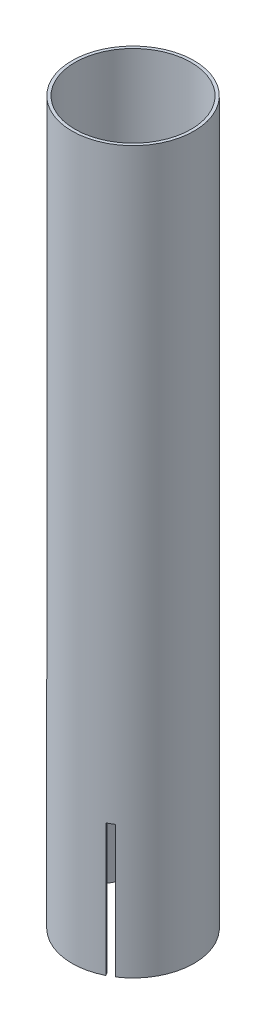
ISO-10303-21;
HEADER;
FILE_DESCRIPTION(('STEP AP214'),'2;1');
FILE_NAME('part.step','',(''),(''),'','','');
FILE_SCHEMA(('AUTOMOTIVE_DESIGN { 1 0 10303 214 1 1 1 1 }'));
ENDSEC;
DATA;
#1=APPLICATION_CONTEXT('core data for automotive mechanical design processes');
#2=APPLICATION_PROTOCOL_DEFINITION('international standard','automotive_design',2000,#1);
#3=PRODUCT_CONTEXT('',#1,'mechanical');
#4=PRODUCT('Part','Part','',(#3));
#5=PRODUCT_RELATED_PRODUCT_CATEGORY('part','',(#4));
#6=PRODUCT_DEFINITION_FORMATION('','',#4);
#7=PRODUCT_DEFINITION_CONTEXT('part definition',#1,'design');
#8=PRODUCT_DEFINITION('design','',#6,#7);
#9=PRODUCT_DEFINITION_SHAPE('','',#8);
#10=(LENGTH_UNIT() NAMED_UNIT(*) SI_UNIT(.MILLI.,.METRE.));
#11=(NAMED_UNIT(*) PLANE_ANGLE_UNIT() SI_UNIT($,.RADIAN.));
#12=(NAMED_UNIT(*) SI_UNIT($,.STERADIAN.) SOLID_ANGLE_UNIT());
#13=UNCERTAINTY_MEASURE_WITH_UNIT(LENGTH_MEASURE(1.E-05),#10,'distance_accuracy_value','');
#14=(GEOMETRIC_REPRESENTATION_CONTEXT(3) GLOBAL_UNCERTAINTY_ASSIGNED_CONTEXT((#13)) GLOBAL_UNIT_ASSIGNED_CONTEXT((#10,
#11,#12)) REPRESENTATION_CONTEXT('',''));
#15=CARTESIAN_POINT('',(0.,0.,0.));
#16=DIRECTION('',(0.,0.,1.));
#17=DIRECTION('',(1.,0.,0.));
#18=AXIS2_PLACEMENT_3D('',#15,#16,#17);
#19=CARTESIAN_POINT('',(0.,0.,0.));
#20=DIRECTION('',(0.,1.,0.));
#21=DIRECTION('',(0.,0.,1.));
#22=AXIS2_PLACEMENT_3D('',#19,#20,#21);
#23=PLANE('',#22);
#24=CARTESIAN_POINT('',(0.,0.,0.));
#25=DIRECTION('',(0.,1.,0.));
#26=DIRECTION('',(0.,0.,1.));
#27=AXIS2_PLACEMENT_3D('',#24,#25,#26);
#28=CIRCLE('',#27,25.4);
#29=CARTESIAN_POINT('',(13.9768730943489,0.,21.2086543303545));
#30=VERTEX_POINT('',#29);
#31=CARTESIAN_POINT('',(13.9768730943486,0.,-21.2086543303547));
#32=VERTEX_POINT('',#31);
#33=EDGE_CURVE('E152',#30,#32,#28,.T.);
#34=ORIENTED_EDGE('',*,*,#33,.F.);
#35=DIRECTION('',(-0.500000000000004,0.,-0.866025403784436));
#36=VECTOR('',#35,1.);
#37=CARTESIAN_POINT('',(18.7990381056768,0.,29.5608891324553));
#38=LINE('',#37,#36);
#39=CARTESIAN_POINT('',(13.3507236724346,0.,20.1241317184691));
#40=VERTEX_POINT('',#39);
#41=EDGE_CURVE('E164',#30,#40,#38,.T.);
#42=ORIENTED_EDGE('',*,*,#41,.T.);
#43=CARTESIAN_POINT('',(0.,0.,0.));
#44=DIRECTION('',(0.,1.,0.));
#45=DIRECTION('',(0.,0.,1.));
#46=AXIS2_PLACEMENT_3D('',#43,#44,#45);
#47=CIRCLE('',#46,24.15);
#48=CARTESIAN_POINT('',(13.3507236724343,0.,-20.1241317184693));
#49=VERTEX_POINT('',#48);
#50=EDGE_CURVE('E211',#40,#49,#47,.T.);
#51=ORIENTED_EDGE('',*,*,#50,.T.);
#52=DIRECTION('',(-0.499999999999992,0.,0.866025403784443));
#53=VECTOR('',#52,1.);
#54=CARTESIAN_POINT('',(18.7990381056764,0.,-29.5608891324555));
#55=LINE('',#54,#53);
#56=EDGE_CURVE('E55',#32,#49,#55,.T.);
#57=ORIENTED_EDGE('',*,*,#56,.F.);
#58=EDGE_LOOP('',(#34,#42,#51,#57));
#59=FACE_BOUND('',#58,.T.);
#60=ADVANCED_FACE('F39',(#59),#23,.F.);
#61=CARTESIAN_POINT('',(11.3787968829953,0.,-22.7086543303547));
#62=VERTEX_POINT('',#61);
#63=CARTESIAN_POINT('',(-25.3556699773443,0.,-1.5));
#64=VERTEX_POINT('',#63);
#65=EDGE_CURVE('E206',#62,#64,#28,.T.);
#66=ORIENTED_EDGE('',*,*,#65,.F.);
#67=DIRECTION('',(-0.499999999999992,0.,0.866025403784443));
#68=VECTOR('',#67,1.);
#69=CARTESIAN_POINT('',(16.2009618943231,0.,-31.0608891324555));
#70=LINE('',#69,#68);
#71=CARTESIAN_POINT('',(10.752647461081,0.,-21.6241317184693));
#72=VERTEX_POINT('',#71);
#73=EDGE_CURVE('E263',#62,#72,#70,.T.);
#74=ORIENTED_EDGE('',*,*,#73,.T.);
#75=CARTESIAN_POINT('',(-24.1033711335158,0.,-1.5));
#76=VERTEX_POINT('',#75);
#77=EDGE_CURVE('E201',#72,#76,#47,.T.);
#78=ORIENTED_EDGE('',*,*,#77,.T.);
#79=DIRECTION('',(1.,0.,0.));
#80=VECTOR('',#79,1.);
#81=CARTESIAN_POINT('',(-35.,0.,-1.5));
#82=LINE('',#81,#80);
#83=EDGE_CURVE('E183',#64,#76,#82,.T.);
#84=ORIENTED_EDGE('',*,*,#83,.F.);
#85=EDGE_LOOP('',(#66,#74,#78,#84));
#86=FACE_BOUND('',#85,.T.);
#87=ADVANCED_FACE('F262',(#86),#23,.F.);
#88=CARTESIAN_POINT('',(0.,300.,0.));
#89=DIRECTION('',(0.,1.,0.));
#90=DIRECTION('',(0.,0.,1.));
#91=AXIS2_PLACEMENT_3D('',#88,#89,#90);
#92=PLANE('',#91);
#93=CARTESIAN_POINT('',(0.,300.,0.));
#94=DIRECTION('',(0.,1.,0.));
#95=DIRECTION('',(0.,0.,1.));
#96=AXIS2_PLACEMENT_3D('',#93,#94,#95);
#97=CIRCLE('',#96,25.4);
#98=CARTESIAN_POINT('',(0.,300.,25.4));
#99=VERTEX_POINT('',#98);
#100=EDGE_CURVE('E212',#99,#99,#97,.T.);
#101=ORIENTED_EDGE('',*,*,#100,.T.);
#102=EDGE_LOOP('',(#101));
#103=FACE_BOUND('',#102,.T.);
#104=CARTESIAN_POINT('',(0.,300.,0.));
#105=DIRECTION('',(0.,1.,0.));
#106=DIRECTION('',(0.,0.,1.));
#107=AXIS2_PLACEMENT_3D('',#104,#105,#106);
#108=CIRCLE('',#107,24.15);
#109=CARTESIAN_POINT('',(0.,300.,24.15));
#110=VERTEX_POINT('',#109);
#111=EDGE_CURVE('E202',#110,#110,#108,.T.);
#112=ORIENTED_EDGE('',*,*,#111,.F.);
#113=EDGE_LOOP('',(#112));
#114=FACE_BOUND('',#113,.T.);
#115=ADVANCED_FACE('F308',(#103,#114),#92,.T.);
#116=CARTESIAN_POINT('',(-24.1033711335158,0.,1.5));
#117=VERTEX_POINT('',#116);
#118=CARTESIAN_POINT('',(10.7526474610813,0.,21.6241317184691));
#119=VERTEX_POINT('',#118);
#120=EDGE_CURVE('E207',#117,#119,#47,.T.);
#121=ORIENTED_EDGE('',*,*,#120,.T.);
#122=DIRECTION('',(-0.500000000000004,0.,-0.866025403784436));
#123=VECTOR('',#122,1.);
#124=CARTESIAN_POINT('',(16.2009618943235,0.,31.0608891324553));
#125=LINE('',#124,#123);
#126=CARTESIAN_POINT('',(11.3787968829956,0.,22.7086543303545));
#127=VERTEX_POINT('',#126);
#128=EDGE_CURVE('E63',#127,#119,#125,.T.);
#129=ORIENTED_EDGE('',*,*,#128,.F.);
#130=CARTESIAN_POINT('',(-25.3556699773443,0.,1.5));
#131=VERTEX_POINT('',#130);
#132=EDGE_CURVE('E217',#131,#127,#28,.T.);
#133=ORIENTED_EDGE('',*,*,#132,.F.);
#134=DIRECTION('',(1.,0.,0.));
#135=VECTOR('',#134,1.);
#136=CARTESIAN_POINT('',(-35.,0.,1.5));
#137=LINE('',#136,#135);
#138=EDGE_CURVE('E173',#131,#117,#137,.T.);
#139=ORIENTED_EDGE('',*,*,#138,.T.);
#140=EDGE_LOOP('',(#121,#129,#133,#139));
#141=FACE_BOUND('',#140,.T.);
#142=ADVANCED_FACE('F280',(#141),#23,.F.);
#143=CARTESIAN_POINT('',(0.,300.,0.));
#144=DIRECTION('',(0.,-1.,0.));
#145=DIRECTION('',(0.,0.,-1.));
#146=AXIS2_PLACEMENT_3D('',#143,#144,#145);
#147=CYLINDRICAL_SURFACE('',#146,25.4);
#148=ORIENTED_EDGE('',*,*,#100,.F.);
#149=EDGE_LOOP('',(#148));
#150=FACE_BOUND('',#149,.T.);
#151=CARTESIAN_POINT('',(0.,55.,0.));
#152=DIRECTION('',(0.,1.,0.));
#153=DIRECTION('',(0.,0.,1.));
#154=AXIS2_PLACEMENT_3D('',#151,#152,#153);
#155=CIRCLE('',#154,25.4);
#156=CARTESIAN_POINT('',(11.3787968829956,55.,22.7086543303545));
#157=VERTEX_POINT('',#156);
#158=CARTESIAN_POINT('',(13.9768730943489,55.,21.2086543303545));
#159=VERTEX_POINT('',#158);
#160=EDGE_CURVE('E140',#157,#159,#155,.T.);
#161=ORIENTED_EDGE('',*,*,#160,.T.);
#162=DIRECTION('',(0.,-1.,0.));
#163=VECTOR('',#162,1.);
#164=CARTESIAN_POINT('',(13.9768730943489,300.,21.2086543303545));
#165=LINE('',#164,#163);
#166=EDGE_CURVE('E170',#159,#30,#165,.T.);
#167=ORIENTED_EDGE('',*,*,#166,.T.);
#168=ORIENTED_EDGE('',*,*,#33,.T.);
#169=DIRECTION('',(0.,-1.,0.));
#170=VECTOR('',#169,1.);
#171=CARTESIAN_POINT('',(13.9768730943486,300.,-21.2086543303547));
#172=LINE('',#171,#170);
#173=CARTESIAN_POINT('',(13.9768730943486,55.,-21.2086543303547));
#174=VERTEX_POINT('',#173);
#175=EDGE_CURVE('E144',#32,#174,#172,.F.);
#176=ORIENTED_EDGE('',*,*,#175,.T.);
#177=CARTESIAN_POINT('',(11.3787968829953,55.,-22.7086543303547));
#178=VERTEX_POINT('',#177);
#179=EDGE_CURVE('E129',#174,#178,#155,.T.);
#180=ORIENTED_EDGE('',*,*,#179,.T.);
#181=DIRECTION('',(0.,-1.,0.));
#182=VECTOR('',#181,1.);
#183=CARTESIAN_POINT('',(11.3787968829953,300.,-22.7086543303547));
#184=LINE('',#183,#182);
#185=EDGE_CURVE('E154',#178,#62,#184,.T.);
#186=ORIENTED_EDGE('',*,*,#185,.T.);
#187=ORIENTED_EDGE('',*,*,#65,.T.);
#188=DIRECTION('',(0.,-1.,0.));
#189=VECTOR('',#188,1.);
#190=CARTESIAN_POINT('',(-25.3556699773443,300.,-1.49999999999996));
#191=LINE('',#190,#189);
#192=CARTESIAN_POINT('',(-25.3556699773443,55.,-1.49999999999999));
#193=VERTEX_POINT('',#192);
#194=EDGE_CURVE('E178',#64,#193,#191,.F.);
#195=ORIENTED_EDGE('',*,*,#194,.T.);
#196=CARTESIAN_POINT('',(0.,55.,0.));
#197=DIRECTION('',(0.,1.,0.));
#198=DIRECTION('',(0.,0.,1.));
#199=AXIS2_PLACEMENT_3D('',#196,#197,#198);
#200=CIRCLE('',#199,25.4);
#201=CARTESIAN_POINT('',(-25.3556699773443,55.,1.50000000000001));
#202=VERTEX_POINT('',#201);
#203=EDGE_CURVE('E193',#193,#202,#200,.T.);
#204=ORIENTED_EDGE('',*,*,#203,.T.);
#205=DIRECTION('',(0.,-1.,0.));
#206=VECTOR('',#205,1.);
#207=CARTESIAN_POINT('',(-25.3556699773443,300.,1.50000000000002));
#208=LINE('',#207,#206);
#209=EDGE_CURVE('E197',#202,#131,#208,.T.);
#210=ORIENTED_EDGE('',*,*,#209,.T.);
#211=ORIENTED_EDGE('',*,*,#132,.T.);
#212=DIRECTION('',(0.,-1.,0.));
#213=VECTOR('',#212,1.);
#214=CARTESIAN_POINT('',(11.3787968829956,300.,22.7086543303545));
#215=LINE('',#214,#213);
#216=EDGE_CURVE('E141',#127,#157,#215,.F.);
#217=ORIENTED_EDGE('',*,*,#216,.T.);
#218=EDGE_LOOP('',(#161,#167,#168,#176,#180,#186,#187,#195,#204,#210,#211,#217));
#219=FACE_BOUND('',#218,.T.);
#220=ADVANCED_FACE('F41',(#150,#219),#147,.T.);
#221=CARTESIAN_POINT('',(0.,300.,0.));
#222=DIRECTION('',(0.,-1.,0.));
#223=DIRECTION('',(0.,0.,-1.));
#224=AXIS2_PLACEMENT_3D('',#221,#222,#223);
#225=CYLINDRICAL_SURFACE('',#224,24.15);
#226=DIRECTION('',(0.,-1.,0.));
#227=VECTOR('',#226,1.);
#228=CARTESIAN_POINT('',(13.3507236724346,300.,20.1241317184691));
#229=LINE('',#228,#227);
#230=CARTESIAN_POINT('',(13.3507236724346,55.,20.1241317184691));
#231=VERTEX_POINT('',#230);
#232=EDGE_CURVE('E11',#231,#40,#229,.T.);
#233=ORIENTED_EDGE('',*,*,#232,.F.);
#234=CARTESIAN_POINT('',(0.,55.,0.));
#235=DIRECTION('',(0.,1.,0.));
#236=DIRECTION('',(0.,0.,1.));
#237=AXIS2_PLACEMENT_3D('',#234,#235,#236);
#238=CIRCLE('',#237,24.15);
#239=CARTESIAN_POINT('',(10.7526474610813,55.,21.6241317184691));
#240=VERTEX_POINT('',#239);
#241=EDGE_CURVE('E48',#240,#231,#238,.T.);
#242=ORIENTED_EDGE('',*,*,#241,.F.);
#243=DIRECTION('',(0.,-1.,0.));
#244=VECTOR('',#243,1.);
#245=CARTESIAN_POINT('',(10.7526474610813,300.,21.6241317184691));
#246=LINE('',#245,#244);
#247=EDGE_CURVE('E236',#119,#240,#246,.F.);
#248=ORIENTED_EDGE('',*,*,#247,.F.);
#249=ORIENTED_EDGE('',*,*,#120,.F.);
#250=DIRECTION('',(0.,-1.,0.));
#251=VECTOR('',#250,1.);
#252=CARTESIAN_POINT('',(-24.1033711335157,300.,1.50000000000002));
#253=LINE('',#252,#251);
#254=CARTESIAN_POINT('',(-24.1033711335158,55.,1.50000000000001));
#255=VERTEX_POINT('',#254);
#256=EDGE_CURVE('E226',#255,#117,#253,.T.);
#257=ORIENTED_EDGE('',*,*,#256,.F.);
#258=CARTESIAN_POINT('',(0.,55.,0.));
#259=DIRECTION('',(0.,1.,0.));
#260=DIRECTION('',(0.,0.,1.));
#261=AXIS2_PLACEMENT_3D('',#258,#259,#260);
#262=CIRCLE('',#261,24.15);
#263=CARTESIAN_POINT('',(-24.1033711335158,55.,-1.49999999999999));
#264=VERTEX_POINT('',#263);
#265=EDGE_CURVE('E223',#264,#255,#262,.T.);
#266=ORIENTED_EDGE('',*,*,#265,.F.);
#267=DIRECTION('',(0.,-1.,0.));
#268=VECTOR('',#267,1.);
#269=CARTESIAN_POINT('',(-24.1033711335158,300.,-1.49999999999996));
#270=LINE('',#269,#268);
#271=EDGE_CURVE('E216',#76,#264,#270,.F.);
#272=ORIENTED_EDGE('',*,*,#271,.F.);
#273=ORIENTED_EDGE('',*,*,#77,.F.);
#274=DIRECTION('',(0.,-1.,0.));
#275=VECTOR('',#274,1.);
#276=CARTESIAN_POINT('',(10.752647461081,300.,-21.6241317184693));
#277=LINE('',#276,#275);
#278=CARTESIAN_POINT('',(10.752647461081,55.,-21.6241317184693));
#279=VERTEX_POINT('',#278);
#280=EDGE_CURVE('E234',#279,#72,#277,.T.);
#281=ORIENTED_EDGE('',*,*,#280,.F.);
#282=CARTESIAN_POINT('',(13.3507236724343,55.,-20.1241317184693));
#283=VERTEX_POINT('',#282);
#284=EDGE_CURVE('E231',#283,#279,#238,.T.);
#285=ORIENTED_EDGE('',*,*,#284,.F.);
#286=DIRECTION('',(0.,-1.,0.));
#287=VECTOR('',#286,1.);
#288=CARTESIAN_POINT('',(13.3507236724343,300.,-20.1241317184693));
#289=LINE('',#288,#287);
#290=EDGE_CURVE('E145',#49,#283,#289,.F.);
#291=ORIENTED_EDGE('',*,*,#290,.F.);
#292=ORIENTED_EDGE('',*,*,#50,.F.);
#293=EDGE_LOOP('',(#233,#242,#248,#249,#257,#266,#272,#273,#281,#285,#291,#292));
#294=FACE_BOUND('',#293,.T.);
#295=ORIENTED_EDGE('',*,*,#111,.T.);
#296=EDGE_LOOP('',(#295));
#297=FACE_BOUND('',#296,.T.);
#298=ADVANCED_FACE('F251',(#294,#297),#225,.F.);
#299=CARTESIAN_POINT('',(-35.,55.,1.50000000000001));
#300=DIRECTION('',(0.,0.,1.));
#301=DIRECTION('',(0.,-1.,0.));
#302=AXIS2_PLACEMENT_3D('',#299,#300,#301);
#303=PLANE('',#302);
#304=DIRECTION('',(1.,0.,0.));
#305=VECTOR('',#304,1.);
#306=CARTESIAN_POINT('',(-35.,55.,1.50000000000001));
#307=LINE('',#306,#305);
#308=EDGE_CURVE('E174',#202,#255,#307,.T.);
#309=ORIENTED_EDGE('',*,*,#308,.T.);
#310=ORIENTED_EDGE('',*,*,#256,.T.);
#311=ORIENTED_EDGE('',*,*,#138,.F.);
#312=ORIENTED_EDGE('',*,*,#209,.F.);
#313=EDGE_LOOP('',(#309,#310,#311,#312));
#314=FACE_BOUND('',#313,.T.);
#315=ADVANCED_FACE('F277',(#314),#303,.F.);
#316=CARTESIAN_POINT('',(-35.,55.,1.50000000000001));
#317=DIRECTION('',(0.,1.,0.));
#318=DIRECTION('',(0.,0.,1.));
#319=AXIS2_PLACEMENT_3D('',#316,#317,#318);
#320=PLANE('',#319);
#321=DIRECTION('',(1.,0.,0.));
#322=VECTOR('',#321,1.);
#323=CARTESIAN_POINT('',(-35.,55.,-1.49999999999999));
#324=LINE('',#323,#322);
#325=EDGE_CURVE('E179',#193,#264,#324,.T.);
#326=ORIENTED_EDGE('',*,*,#325,.T.);
#327=ORIENTED_EDGE('',*,*,#265,.T.);
#328=ORIENTED_EDGE('',*,*,#308,.F.);
#329=ORIENTED_EDGE('',*,*,#203,.F.);
#330=EDGE_LOOP('',(#326,#327,#328,#329));
#331=FACE_BOUND('',#330,.T.);
#332=ADVANCED_FACE('F275',(#331),#320,.F.);
#333=CARTESIAN_POINT('',(-35.,55.,-1.49999999999999));
#334=DIRECTION('',(0.,0.,-1.));
#335=DIRECTION('',(0.,1.,0.));
#336=AXIS2_PLACEMENT_3D('',#333,#334,#335);
#337=PLANE('',#336);
#338=ORIENTED_EDGE('',*,*,#83,.T.);
#339=ORIENTED_EDGE('',*,*,#271,.T.);
#340=ORIENTED_EDGE('',*,*,#325,.F.);
#341=ORIENTED_EDGE('',*,*,#194,.F.);
#342=EDGE_LOOP('',(#338,#339,#340,#341));
#343=FACE_BOUND('',#342,.T.);
#344=ADVANCED_FACE('F268',(#343),#337,.F.);
#345=CARTESIAN_POINT('',(16.2009618943231,55.,-31.0608891324555));
#346=DIRECTION('',(-0.866025403784443,0.,-0.499999999999992));
#347=DIRECTION('',(-0.499999999999992,0.,0.866025403784443));
#348=AXIS2_PLACEMENT_3D('',#345,#346,#347);
#349=PLANE('',#348);
#350=DIRECTION('',(-0.499999999999992,0.,0.866025403784443));
#351=VECTOR('',#350,1.);
#352=CARTESIAN_POINT('',(16.2009618943231,55.,-31.0608891324555));
#353=LINE('',#352,#351);
#354=EDGE_CURVE('E135',#178,#279,#353,.T.);
#355=ORIENTED_EDGE('',*,*,#354,.T.);
#356=ORIENTED_EDGE('',*,*,#280,.T.);
#357=ORIENTED_EDGE('',*,*,#73,.F.);
#358=ORIENTED_EDGE('',*,*,#185,.F.);
#359=EDGE_LOOP('',(#355,#356,#357,#358));
#360=FACE_BOUND('',#359,.T.);
#361=ADVANCED_FACE('F292',(#360),#349,.F.);
#362=CARTESIAN_POINT('',(18.7990381056764,55.,-29.5608891324555));
#363=DIRECTION('',(0.866025403784443,0.,0.499999999999992));
#364=DIRECTION('',(0.499999999999992,0.,-0.866025403784443));
#365=AXIS2_PLACEMENT_3D('',#362,#363,#364);
#366=PLANE('',#365);
#367=ORIENTED_EDGE('',*,*,#56,.T.);
#368=ORIENTED_EDGE('',*,*,#290,.T.);
#369=DIRECTION('',(-0.499999999999992,0.,0.866025403784443));
#370=VECTOR('',#369,1.);
#371=CARTESIAN_POINT('',(18.7990381056764,55.,-29.5608891324555));
#372=LINE('',#371,#370);
#373=EDGE_CURVE('E132',#174,#283,#372,.T.);
#374=ORIENTED_EDGE('',*,*,#373,.F.);
#375=ORIENTED_EDGE('',*,*,#175,.F.);
#376=EDGE_LOOP('',(#367,#368,#374,#375));
#377=FACE_BOUND('',#376,.T.);
#378=ADVANCED_FACE('F143',(#377),#366,.F.);
#379=CARTESIAN_POINT('',(18.7990381056768,55.,29.5608891324553));
#380=DIRECTION('',(0.,1.,0.));
#381=DIRECTION('',(0.,0.,1.));
#382=AXIS2_PLACEMENT_3D('',#379,#380,#381);
#383=PLANE('',#382);
#384=ORIENTED_EDGE('',*,*,#373,.T.);
#385=ORIENTED_EDGE('',*,*,#284,.T.);
#386=ORIENTED_EDGE('',*,*,#354,.F.);
#387=ORIENTED_EDGE('',*,*,#179,.F.);
#388=EDGE_LOOP('',(#384,#385,#386,#387));
#389=FACE_BOUND('',#388,.T.);
#390=ADVANCED_FACE('F131',(#389),#383,.F.);
#391=CARTESIAN_POINT('',(18.7990381056768,55.,29.5608891324553));
#392=DIRECTION('',(0.866025403784436,0.,-0.500000000000004));
#393=DIRECTION('',(-0.500000000000004,0.,-0.866025403784436));
#394=AXIS2_PLACEMENT_3D('',#391,#392,#393);
#395=PLANE('',#394);
#396=DIRECTION('',(-0.500000000000004,0.,-0.866025403784436));
#397=VECTOR('',#396,1.);
#398=CARTESIAN_POINT('',(18.7990381056768,55.,29.5608891324553));
#399=LINE('',#398,#397);
#400=EDGE_CURVE('E155',#159,#231,#399,.T.);
#401=ORIENTED_EDGE('',*,*,#400,.T.);
#402=ORIENTED_EDGE('',*,*,#232,.T.);
#403=ORIENTED_EDGE('',*,*,#41,.F.);
#404=ORIENTED_EDGE('',*,*,#166,.F.);
#405=EDGE_LOOP('',(#401,#402,#403,#404));
#406=FACE_BOUND('',#405,.T.);
#407=ADVANCED_FACE('F248',(#406),#395,.F.);
#408=DIRECTION('',(-0.500000000000004,0.,-0.866025403784436));
#409=VECTOR('',#408,1.);
#410=CARTESIAN_POINT('',(16.2009618943235,55.,31.0608891324553));
#411=LINE('',#410,#409);
#412=EDGE_CURVE('E161',#157,#240,#411,.T.);
#413=ORIENTED_EDGE('',*,*,#412,.T.);
#414=ORIENTED_EDGE('',*,*,#241,.T.);
#415=ORIENTED_EDGE('',*,*,#400,.F.);
#416=ORIENTED_EDGE('',*,*,#160,.F.);
#417=EDGE_LOOP('',(#413,#414,#415,#416));
#418=FACE_BOUND('',#417,.T.);
#419=ADVANCED_FACE('F244',(#418),#383,.F.);
#420=CARTESIAN_POINT('',(16.2009618943235,55.,31.0608891324553));
#421=DIRECTION('',(-0.866025403784436,0.,0.500000000000004));
#422=DIRECTION('',(0.500000000000004,0.,0.866025403784436));
#423=AXIS2_PLACEMENT_3D('',#420,#421,#422);
#424=PLANE('',#423);
#425=ORIENTED_EDGE('',*,*,#128,.T.);
#426=ORIENTED_EDGE('',*,*,#247,.T.);
#427=ORIENTED_EDGE('',*,*,#412,.F.);
#428=ORIENTED_EDGE('',*,*,#216,.F.);
#429=EDGE_LOOP('',(#425,#426,#427,#428));
#430=FACE_BOUND('',#429,.T.);
#431=ADVANCED_FACE('F329',(#430),#424,.F.);
#432=CLOSED_SHELL('',(#60,#87,#115,#142,#220,#298,#315,#332,#344,#361,#378,#390,#407,#419,#431));
#433=MANIFOLD_SOLID_BREP('B2',#432);
#434=ADVANCED_BREP_SHAPE_REPRESENTATION('',(#18,#433),#14);
#435=SHAPE_DEFINITION_REPRESENTATION(#9,#434);
ENDSEC;
END-ISO-10303-21;
